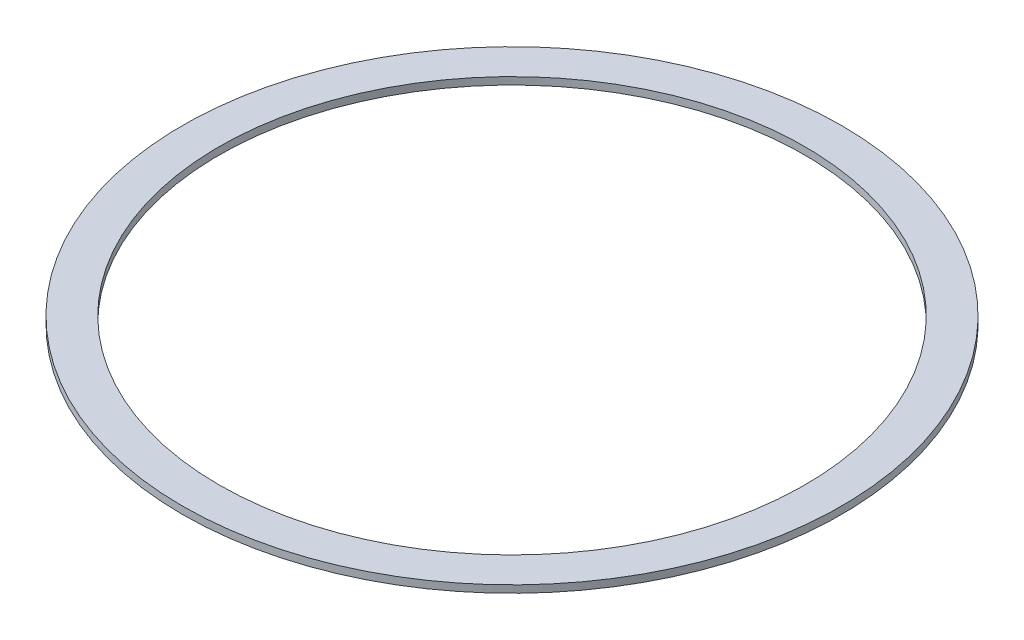
ISO-10303-21;
HEADER;
FILE_DESCRIPTION(('STEP AP214'),'2;1');
FILE_NAME('part.step','',(''),(''),'','','');
FILE_SCHEMA(('AUTOMOTIVE_DESIGN { 1 0 10303 214 1 1 1 1 }'));
ENDSEC;
DATA;
#1=APPLICATION_CONTEXT('core data for automotive mechanical design processes');
#2=APPLICATION_PROTOCOL_DEFINITION('international standard','automotive_design',2000,#1);
#3=PRODUCT_CONTEXT('',#1,'mechanical');
#4=PRODUCT('Part','Part','',(#3));
#5=PRODUCT_RELATED_PRODUCT_CATEGORY('part','',(#4));
#6=PRODUCT_DEFINITION_FORMATION('','',#4);
#7=PRODUCT_DEFINITION_CONTEXT('part definition',#1,'design');
#8=PRODUCT_DEFINITION('design','',#6,#7);
#9=PRODUCT_DEFINITION_SHAPE('','',#8);
#10=(LENGTH_UNIT() NAMED_UNIT(*) SI_UNIT(.MILLI.,.METRE.));
#11=(NAMED_UNIT(*) PLANE_ANGLE_UNIT() SI_UNIT($,.RADIAN.));
#12=(NAMED_UNIT(*) SI_UNIT($,.STERADIAN.) SOLID_ANGLE_UNIT());
#13=UNCERTAINTY_MEASURE_WITH_UNIT(LENGTH_MEASURE(1.E-05),#10,'distance_accuracy_value','');
#14=(GEOMETRIC_REPRESENTATION_CONTEXT(3) GLOBAL_UNCERTAINTY_ASSIGNED_CONTEXT((#13)) GLOBAL_UNIT_ASSIGNED_CONTEXT((#10,
#11,#12)) REPRESENTATION_CONTEXT('',''));
#15=CARTESIAN_POINT('',(0.,0.,0.));
#16=DIRECTION('',(0.,0.,1.));
#17=DIRECTION('',(1.,0.,0.));
#18=AXIS2_PLACEMENT_3D('',#15,#16,#17);
#19=CARTESIAN_POINT('',(0.,0.5,0.));
#20=DIRECTION('',(0.,1.,0.));
#21=DIRECTION('',(0.,0.,1.));
#22=AXIS2_PLACEMENT_3D('',#19,#20,#21);
#23=PLANE('',#22);
#24=CARTESIAN_POINT('',(0.,0.5,0.));
#25=DIRECTION('',(0.,1.,0.));
#26=DIRECTION('',(0.,0.,1.));
#27=AXIS2_PLACEMENT_3D('',#24,#25,#26);
#28=CIRCLE('',#27,22.5);
#29=CARTESIAN_POINT('',(0.,0.5,22.5));
#30=VERTEX_POINT('',#29);
#31=EDGE_CURVE('E10',#30,#30,#28,.T.);
#32=ORIENTED_EDGE('',*,*,#31,.T.);
#33=EDGE_LOOP('',(#32));
#34=FACE_BOUND('',#33,.T.);
#35=CARTESIAN_POINT('',(0.,0.5,0.));
#36=DIRECTION('',(0.,1.,0.));
#37=DIRECTION('',(0.,0.,1.));
#38=AXIS2_PLACEMENT_3D('',#35,#36,#37);
#39=CIRCLE('',#38,20.);
#40=CARTESIAN_POINT('',(0.,0.5,20.));
#41=VERTEX_POINT('',#40);
#42=EDGE_CURVE('E56',#41,#41,#39,.T.);
#43=ORIENTED_EDGE('',*,*,#42,.F.);
#44=EDGE_LOOP('',(#43));
#45=FACE_BOUND('',#44,.T.);
#46=ADVANCED_FACE('F43',(#34,#45),#23,.T.);
#47=CARTESIAN_POINT('',(0.,0.,0.));
#48=DIRECTION('',(0.,1.,0.));
#49=DIRECTION('',(0.,0.,1.));
#50=AXIS2_PLACEMENT_3D('',#47,#48,#49);
#51=PLANE('',#50);
#52=CARTESIAN_POINT('',(0.,0.,0.));
#53=DIRECTION('',(0.,1.,0.));
#54=DIRECTION('',(0.,0.,1.));
#55=AXIS2_PLACEMENT_3D('',#52,#53,#54);
#56=CIRCLE('',#55,22.5);
#57=CARTESIAN_POINT('',(0.,0.,22.5));
#58=VERTEX_POINT('',#57);
#59=EDGE_CURVE('E47',#58,#58,#56,.T.);
#60=ORIENTED_EDGE('',*,*,#59,.F.);
#61=EDGE_LOOP('',(#60));
#62=FACE_BOUND('',#61,.T.);
#63=CARTESIAN_POINT('',(0.,0.,0.));
#64=DIRECTION('',(0.,1.,0.));
#65=DIRECTION('',(0.,0.,1.));
#66=AXIS2_PLACEMENT_3D('',#63,#64,#65);
#67=CIRCLE('',#66,20.);
#68=CARTESIAN_POINT('',(0.,0.,20.));
#69=VERTEX_POINT('',#68);
#70=EDGE_CURVE('E58',#69,#69,#67,.T.);
#71=ORIENTED_EDGE('',*,*,#70,.T.);
#72=EDGE_LOOP('',(#71));
#73=FACE_BOUND('',#72,.T.);
#74=ADVANCED_FACE('F70',(#62,#73),#51,.F.);
#75=CARTESIAN_POINT('',(0.,0.5,0.));
#76=DIRECTION('',(0.,-1.,0.));
#77=DIRECTION('',(0.,0.,-1.));
#78=AXIS2_PLACEMENT_3D('',#75,#76,#77);
#79=CYLINDRICAL_SURFACE('',#78,22.5);
#80=ORIENTED_EDGE('',*,*,#31,.F.);
#81=EDGE_LOOP('',(#80));
#82=FACE_BOUND('',#81,.T.);
#83=ORIENTED_EDGE('',*,*,#59,.T.);
#84=EDGE_LOOP('',(#83));
#85=FACE_BOUND('',#84,.T.);
#86=ADVANCED_FACE('F45',(#82,#85),#79,.T.);
#87=CARTESIAN_POINT('',(0.,0.5,0.));
#88=DIRECTION('',(0.,-1.,0.));
#89=DIRECTION('',(0.,0.,-1.));
#90=AXIS2_PLACEMENT_3D('',#87,#88,#89);
#91=CYLINDRICAL_SURFACE('',#90,20.);
#92=ORIENTED_EDGE('',*,*,#42,.T.);
#93=EDGE_LOOP('',(#92));
#94=FACE_BOUND('',#93,.T.);
#95=ORIENTED_EDGE('',*,*,#70,.F.);
#96=EDGE_LOOP('',(#95));
#97=FACE_BOUND('',#96,.T.);
#98=ADVANCED_FACE('F66',(#94,#97),#91,.F.);
#99=CLOSED_SHELL('',(#46,#74,#86,#98));
#100=MANIFOLD_SOLID_BREP('B2',#99);
#101=ADVANCED_BREP_SHAPE_REPRESENTATION('',(#18,#100),#14);
#102=SHAPE_DEFINITION_REPRESENTATION(#9,#101);
ENDSEC;
END-ISO-10303-21;
